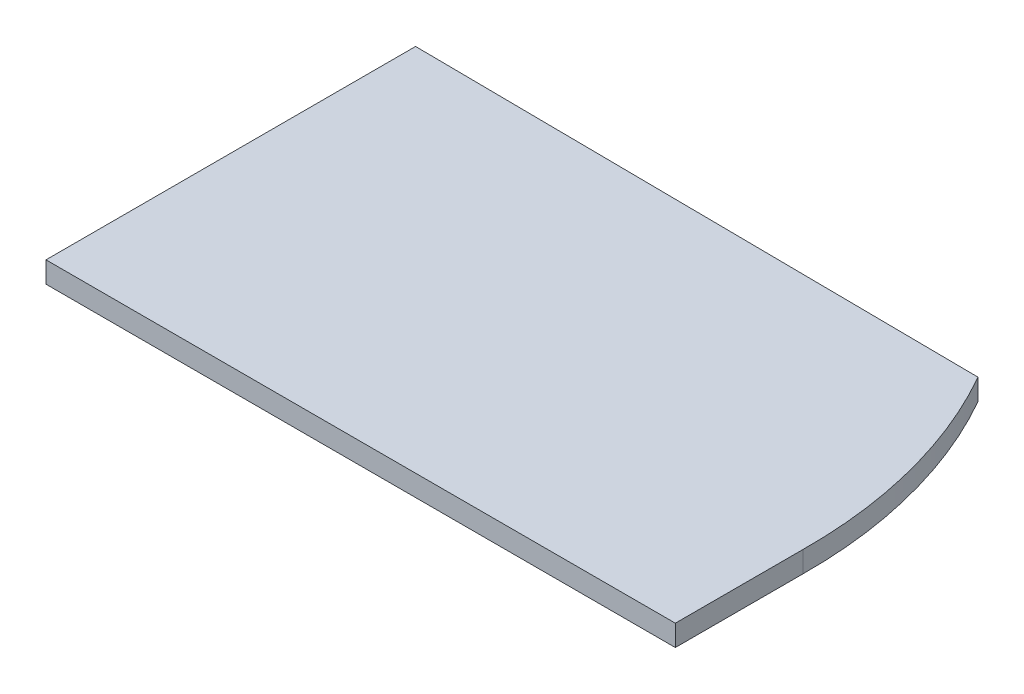
ISO-10303-21;
HEADER;
FILE_DESCRIPTION(('STEP AP214'),'2;1');
FILE_NAME('part.step','',(''),(''),'','','');
FILE_SCHEMA(('AUTOMOTIVE_DESIGN { 1 0 10303 214 1 1 1 1 }'));
ENDSEC;
DATA;
#1=APPLICATION_CONTEXT('core data for automotive mechanical design processes');
#2=APPLICATION_PROTOCOL_DEFINITION('international standard','automotive_design',2000,#1);
#3=PRODUCT_CONTEXT('',#1,'mechanical');
#4=PRODUCT('Part','Part','',(#3));
#5=PRODUCT_RELATED_PRODUCT_CATEGORY('part','',(#4));
#6=PRODUCT_DEFINITION_FORMATION('','',#4);
#7=PRODUCT_DEFINITION_CONTEXT('part definition',#1,'design');
#8=PRODUCT_DEFINITION('design','',#6,#7);
#9=PRODUCT_DEFINITION_SHAPE('','',#8);
#10=(LENGTH_UNIT() NAMED_UNIT(*) SI_UNIT(.MILLI.,.METRE.));
#11=(NAMED_UNIT(*) PLANE_ANGLE_UNIT() SI_UNIT($,.RADIAN.));
#12=(NAMED_UNIT(*) SI_UNIT($,.STERADIAN.) SOLID_ANGLE_UNIT());
#13=UNCERTAINTY_MEASURE_WITH_UNIT(LENGTH_MEASURE(1.E-05),#10,'distance_accuracy_value','');
#14=(GEOMETRIC_REPRESENTATION_CONTEXT(3) GLOBAL_UNCERTAINTY_ASSIGNED_CONTEXT((#13)) GLOBAL_UNIT_ASSIGNED_CONTEXT((#10,
#11,#12)) REPRESENTATION_CONTEXT('',''));
#15=CARTESIAN_POINT('',(0.,0.,0.));
#16=DIRECTION('',(0.,0.,1.));
#17=DIRECTION('',(1.,0.,0.));
#18=AXIS2_PLACEMENT_3D('',#15,#16,#17);
#19=CARTESIAN_POINT('',(0.,10.,0.));
#20=DIRECTION('',(1.,0.,0.));
#21=DIRECTION('',(0.,0.,-1.));
#22=AXIS2_PLACEMENT_3D('',#19,#20,#21);
#23=PLANE('',#22);
#24=DIRECTION('',(0.,0.,1.));
#25=VECTOR('',#24,1.);
#26=CARTESIAN_POINT('',(0.,0.,0.));
#27=LINE('',#26,#25);
#28=CARTESIAN_POINT('',(0.,0.,-175.));
#29=VERTEX_POINT('',#28);
#30=CARTESIAN_POINT('',(0.,0.,0.));
#31=VERTEX_POINT('',#30);
#32=EDGE_CURVE('E107',#29,#31,#27,.T.);
#33=ORIENTED_EDGE('',*,*,#32,.T.);
#34=DIRECTION('',(0.,-1.,0.));
#35=VECTOR('',#34,1.);
#36=CARTESIAN_POINT('',(0.,10.,0.));
#37=LINE('',#36,#35);
#38=CARTESIAN_POINT('',(0.,10.,0.));
#39=VERTEX_POINT('',#38);
#40=EDGE_CURVE('E11',#39,#31,#37,.T.);
#41=ORIENTED_EDGE('',*,*,#40,.F.);
#42=DIRECTION('',(0.,0.,1.));
#43=VECTOR('',#42,1.);
#44=CARTESIAN_POINT('',(0.,10.,0.));
#45=LINE('',#44,#43);
#46=CARTESIAN_POINT('',(0.,10.,-175.));
#47=VERTEX_POINT('',#46);
#48=EDGE_CURVE('E115',#47,#39,#45,.T.);
#49=ORIENTED_EDGE('',*,*,#48,.F.);
#50=DIRECTION('',(0.,-1.,0.));
#51=VECTOR('',#50,1.);
#52=CARTESIAN_POINT('',(0.,10.,-175.));
#53=LINE('',#52,#51);
#54=EDGE_CURVE('E103',#47,#29,#53,.T.);
#55=ORIENTED_EDGE('',*,*,#54,.T.);
#56=EDGE_LOOP('',(#33,#41,#49,#55));
#57=FACE_BOUND('',#56,.T.);
#58=ADVANCED_FACE('F33',(#57),#23,.F.);
#59=CARTESIAN_POINT('',(0.,10.,0.));
#60=DIRECTION('',(0.,0.,-1.));
#61=DIRECTION('',(-1.,0.,0.));
#62=AXIS2_PLACEMENT_3D('',#59,#60,#61);
#63=PLANE('',#62);
#64=DIRECTION('',(1.,0.,0.));
#65=VECTOR('',#64,1.);
#66=CARTESIAN_POINT('',(0.,0.,0.));
#67=LINE('',#66,#65);
#68=CARTESIAN_POINT('',(297.999999999993,0.,0.));
#69=VERTEX_POINT('',#68);
#70=EDGE_CURVE('E110',#31,#69,#67,.T.);
#71=ORIENTED_EDGE('',*,*,#70,.T.);
#72=DIRECTION('',(0.,-1.,0.));
#73=VECTOR('',#72,1.);
#74=CARTESIAN_POINT('',(297.999999999993,10.,0.));
#75=LINE('',#74,#73);
#76=CARTESIAN_POINT('',(297.999999999993,10.,0.));
#77=VERTEX_POINT('',#76);
#78=EDGE_CURVE('E41',#77,#69,#75,.T.);
#79=ORIENTED_EDGE('',*,*,#78,.F.);
#80=DIRECTION('',(1.,0.,0.));
#81=VECTOR('',#80,1.);
#82=CARTESIAN_POINT('',(0.,10.,0.));
#83=LINE('',#82,#81);
#84=EDGE_CURVE('E83',#39,#77,#83,.T.);
#85=ORIENTED_EDGE('',*,*,#84,.F.);
#86=ORIENTED_EDGE('',*,*,#40,.T.);
#87=EDGE_LOOP('',(#71,#79,#85,#86));
#88=FACE_BOUND('',#87,.T.);
#89=ADVANCED_FACE('F134',(#88),#63,.F.);
#90=CARTESIAN_POINT('',(297.999999999993,10.,0.));
#91=DIRECTION('',(-1.,0.,0.));
#92=DIRECTION('',(0.,0.,1.));
#93=AXIS2_PLACEMENT_3D('',#90,#91,#92);
#94=PLANE('',#93);
#95=DIRECTION('',(0.,0.,-1.));
#96=VECTOR('',#95,1.);
#97=CARTESIAN_POINT('',(297.999999999993,0.,0.));
#98=LINE('',#97,#96);
#99=CARTESIAN_POINT('',(297.999999999993,0.,-60.4094204357343));
#100=VERTEX_POINT('',#99);
#101=EDGE_CURVE('E98',#69,#100,#98,.T.);
#102=ORIENTED_EDGE('',*,*,#101,.T.);
#103=DIRECTION('',(0.,-1.,0.));
#104=VECTOR('',#103,1.);
#105=CARTESIAN_POINT('',(297.999999999993,10.,-60.4094204357343));
#106=LINE('',#105,#104);
#107=CARTESIAN_POINT('',(297.999999999993,10.,-60.4094204357343));
#108=VERTEX_POINT('',#107);
#109=EDGE_CURVE('E95',#108,#100,#106,.T.);
#110=ORIENTED_EDGE('',*,*,#109,.F.);
#111=DIRECTION('',(0.,0.,-1.));
#112=VECTOR('',#111,1.);
#113=CARTESIAN_POINT('',(297.999999999993,10.,0.));
#114=LINE('',#113,#112);
#115=EDGE_CURVE('E87',#77,#108,#114,.T.);
#116=ORIENTED_EDGE('',*,*,#115,.F.);
#117=ORIENTED_EDGE('',*,*,#78,.T.);
#118=EDGE_LOOP('',(#102,#110,#116,#117));
#119=FACE_BOUND('',#118,.T.);
#120=ADVANCED_FACE('F96',(#119),#94,.F.);
#121=CARTESIAN_POINT('',(75.7282938212156,10.,-62.350724921343));
#122=DIRECTION('',(0.,-1.,0.));
#123=DIRECTION('',(0.,0.,-1.));
#124=AXIS2_PLACEMENT_3D('',#121,#122,#123);
#125=CYLINDRICAL_SURFACE('',#124,222.280183621326);
#126=CARTESIAN_POINT('',(75.7282938212156,0.,-62.350724921343));
#127=DIRECTION('',(0.,1.,0.));
#128=DIRECTION('',(0.,0.,1.));
#129=AXIS2_PLACEMENT_3D('',#126,#127,#128);
#130=CIRCLE('',#129,222.280183621326);
#131=CARTESIAN_POINT('',(268.774701070177,0.,-172.539493309953));
#132=VERTEX_POINT('',#131);
#133=EDGE_CURVE('E69',#100,#132,#130,.T.);
#134=ORIENTED_EDGE('',*,*,#133,.T.);
#135=DIRECTION('',(0.,-1.,0.));
#136=VECTOR('',#135,1.);
#137=CARTESIAN_POINT('',(268.774701070177,10.,-172.539493309953));
#138=LINE('',#137,#136);
#139=CARTESIAN_POINT('',(268.774701070177,10.,-172.539493309953));
#140=VERTEX_POINT('',#139);
#141=EDGE_CURVE('E99',#140,#132,#138,.T.);
#142=ORIENTED_EDGE('',*,*,#141,.F.);
#143=CARTESIAN_POINT('',(75.7282938212156,10.,-62.350724921343));
#144=DIRECTION('',(0.,1.,0.));
#145=DIRECTION('',(0.,0.,1.));
#146=AXIS2_PLACEMENT_3D('',#143,#144,#145);
#147=CIRCLE('',#146,222.280183621326);
#148=EDGE_CURVE('E91',#108,#140,#147,.T.);
#149=ORIENTED_EDGE('',*,*,#148,.F.);
#150=ORIENTED_EDGE('',*,*,#109,.T.);
#151=EDGE_LOOP('',(#134,#142,#149,#150));
#152=FACE_BOUND('',#151,.T.);
#153=ADVANCED_FACE('F101',(#152),#125,.T.);
#154=CARTESIAN_POINT('',(0.,10.,-175.));
#155=DIRECTION('',(-0.00915414875276671,0.,0.999958099902497));
#156=DIRECTION('',(0.999958099902497,0.,0.00915414875276671));
#157=AXIS2_PLACEMENT_3D('',#154,#155,#156);
#158=PLANE('',#157);
#159=DIRECTION('',(-0.999958099902497,0.,-0.00915414875276671));
#160=VECTOR('',#159,1.);
#161=CARTESIAN_POINT('',(0.,0.,-175.));
#162=LINE('',#161,#160);
#163=EDGE_CURVE('E75',#132,#29,#162,.T.);
#164=ORIENTED_EDGE('',*,*,#163,.T.);
#165=ORIENTED_EDGE('',*,*,#54,.F.);
#166=DIRECTION('',(-0.999958099902497,0.,-0.00915414875276671));
#167=VECTOR('',#166,1.);
#168=CARTESIAN_POINT('',(0.,10.,-175.));
#169=LINE('',#168,#167);
#170=EDGE_CURVE('E49',#140,#47,#169,.T.);
#171=ORIENTED_EDGE('',*,*,#170,.F.);
#172=ORIENTED_EDGE('',*,*,#141,.T.);
#173=EDGE_LOOP('',(#164,#165,#171,#172));
#174=FACE_BOUND('',#173,.T.);
#175=ADVANCED_FACE('F123',(#174),#158,.F.);
#176=CARTESIAN_POINT('',(75.7282938212156,10.,-62.350724921343));
#177=DIRECTION('',(0.,1.,0.));
#178=DIRECTION('',(0.,0.,1.));
#179=AXIS2_PLACEMENT_3D('',#176,#177,#178);
#180=PLANE('',#179);
#181=ORIENTED_EDGE('',*,*,#48,.T.);
#182=ORIENTED_EDGE('',*,*,#84,.T.);
#183=ORIENTED_EDGE('',*,*,#115,.T.);
#184=ORIENTED_EDGE('',*,*,#148,.T.);
#185=ORIENTED_EDGE('',*,*,#170,.T.);
#186=EDGE_LOOP('',(#181,#182,#183,#184,#185));
#187=FACE_BOUND('',#186,.T.);
#188=ADVANCED_FACE('F89',(#187),#180,.T.);
#189=CARTESIAN_POINT('',(75.7282938212156,0.,-62.350724921343));
#190=DIRECTION('',(0.,1.,0.));
#191=DIRECTION('',(0.,0.,1.));
#192=AXIS2_PLACEMENT_3D('',#189,#190,#191);
#193=PLANE('',#192);
#194=ORIENTED_EDGE('',*,*,#32,.F.);
#195=ORIENTED_EDGE('',*,*,#163,.F.);
#196=ORIENTED_EDGE('',*,*,#133,.F.);
#197=ORIENTED_EDGE('',*,*,#101,.F.);
#198=ORIENTED_EDGE('',*,*,#70,.F.);
#199=EDGE_LOOP('',(#194,#195,#196,#197,#198));
#200=FACE_BOUND('',#199,.T.);
#201=ADVANCED_FACE('F119',(#200),#193,.F.);
#202=CLOSED_SHELL('',(#58,#89,#120,#153,#175,#188,#201));
#203=MANIFOLD_SOLID_BREP('B2',#202);
#204=ADVANCED_BREP_SHAPE_REPRESENTATION('',(#18,#203),#14);
#205=SHAPE_DEFINITION_REPRESENTATION(#9,#204);
ENDSEC;
END-ISO-10303-21;
